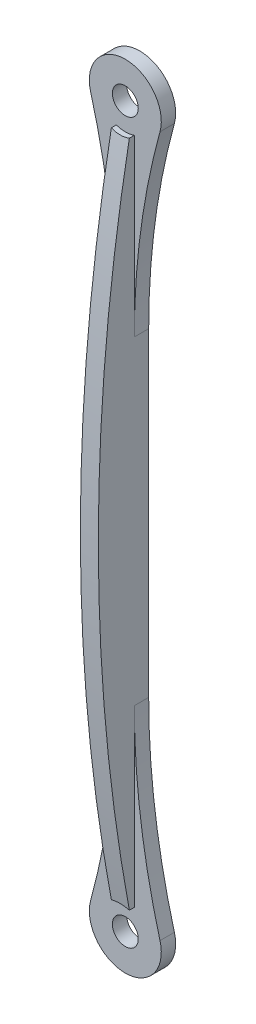
ISO-10303-21;
HEADER;
FILE_DESCRIPTION(('STEP AP214'),'2;1');
FILE_NAME('part.step','',(''),(''),'','','');
FILE_SCHEMA(('AUTOMOTIVE_DESIGN { 1 0 10303 214 1 1 1 1 }'));
ENDSEC;
DATA;
#1=APPLICATION_CONTEXT('core data for automotive mechanical design processes');
#2=APPLICATION_PROTOCOL_DEFINITION('international standard','automotive_design',2000,#1);
#3=PRODUCT_CONTEXT('',#1,'mechanical');
#4=PRODUCT('Part','Part','',(#3));
#5=PRODUCT_RELATED_PRODUCT_CATEGORY('part','',(#4));
#6=PRODUCT_DEFINITION_FORMATION('','',#4);
#7=PRODUCT_DEFINITION_CONTEXT('part definition',#1,'design');
#8=PRODUCT_DEFINITION('design','',#6,#7);
#9=PRODUCT_DEFINITION_SHAPE('','',#8);
#10=(LENGTH_UNIT() NAMED_UNIT(*) SI_UNIT(.MILLI.,.METRE.));
#11=(NAMED_UNIT(*) PLANE_ANGLE_UNIT() SI_UNIT($,.RADIAN.));
#12=(NAMED_UNIT(*) SI_UNIT($,.STERADIAN.) SOLID_ANGLE_UNIT());
#13=UNCERTAINTY_MEASURE_WITH_UNIT(LENGTH_MEASURE(1.E-05),#10,'distance_accuracy_value','');
#14=(GEOMETRIC_REPRESENTATION_CONTEXT(3) GLOBAL_UNCERTAINTY_ASSIGNED_CONTEXT((#13)) GLOBAL_UNIT_ASSIGNED_CONTEXT((#10,
#11,#12)) REPRESENTATION_CONTEXT('',''));
#15=CARTESIAN_POINT('',(0.,0.,0.));
#16=DIRECTION('',(0.,0.,1.));
#17=DIRECTION('',(1.,0.,0.));
#18=AXIS2_PLACEMENT_3D('',#15,#16,#17);
#19=CARTESIAN_POINT('',(1.58749999999998,91.6803547052069,2.54));
#20=DIRECTION('',(-1.,0.,0.));
#21=DIRECTION('',(0.,-1.,0.));
#22=AXIS2_PLACEMENT_3D('',#19,#20,#21);
#23=PLANE('',#22);
#24=DIRECTION('',(0.,0.,-1.));
#25=VECTOR('',#24,1.);
#26=CARTESIAN_POINT('',(1.58750000000004,4.49012806053456,8.89000000000001));
#27=LINE('',#26,#25);
#28=CARTESIAN_POINT('',(1.58750000000004,4.49012806053456,2.54));
#29=VERTEX_POINT('',#28);
#30=CARTESIAN_POINT('',(1.5875,4.49012806053458,3.41381129009333));
#31=VERTEX_POINT('',#30);
#32=EDGE_CURVE('E271',#29,#31,#27,.F.);
#33=ORIENTED_EDGE('',*,*,#32,.F.);
#34=DIRECTION('',(0.,1.,0.));
#35=VECTOR('',#34,1.);
#36=CARTESIAN_POINT('',(1.5875,0.,2.54));
#37=LINE('',#36,#35);
#38=CARTESIAN_POINT('',(1.5875,35.319645294793,2.54000000000001));
#39=VERTEX_POINT('',#38);
#40=EDGE_CURVE('E269',#29,#39,#37,.T.);
#41=ORIENTED_EDGE('',*,*,#40,.T.);
#42=DIRECTION('',(0.,0.,-1.));
#43=VECTOR('',#42,1.);
#44=CARTESIAN_POINT('',(1.58750000000002,35.319645294793,2.54));
#45=LINE('',#44,#43);
#46=CARTESIAN_POINT('',(1.58750000000002,35.319645294793,0.));
#47=VERTEX_POINT('',#46);
#48=EDGE_CURVE('E240',#39,#47,#45,.T.);
#49=ORIENTED_EDGE('',*,*,#48,.T.);
#50=DIRECTION('',(0.,1.,0.));
#51=VECTOR('',#50,1.);
#52=CARTESIAN_POINT('',(1.58749999999998,91.6803547052069,0.));
#53=LINE('',#52,#51);
#54=CARTESIAN_POINT('',(1.58749999999998,91.6803547052069,0.));
#55=VERTEX_POINT('',#54);
#56=EDGE_CURVE('E243',#47,#55,#53,.T.);
#57=ORIENTED_EDGE('',*,*,#56,.T.);
#58=DIRECTION('',(0.,0.,-1.));
#59=VECTOR('',#58,1.);
#60=CARTESIAN_POINT('',(1.58749999999998,91.6803547052069,2.54));
#61=LINE('',#60,#59);
#62=CARTESIAN_POINT('',(1.5875,91.6803547052069,2.54000000000002));
#63=VERTEX_POINT('',#62);
#64=EDGE_CURVE('E264',#63,#55,#61,.T.);
#65=ORIENTED_EDGE('',*,*,#64,.F.);
#66=DIRECTION('',(0.,1.,0.));
#67=VECTOR('',#66,1.);
#68=CARTESIAN_POINT('',(1.58749999999999,35.319645294793,2.54));
#69=LINE('',#68,#67);
#70=CARTESIAN_POINT('',(1.5875,122.509871939465,2.54));
#71=VERTEX_POINT('',#70);
#72=EDGE_CURVE('E167',#63,#71,#69,.T.);
#73=ORIENTED_EDGE('',*,*,#72,.T.);
#74=DIRECTION('',(0.,0.,-1.));
#75=VECTOR('',#74,1.);
#76=CARTESIAN_POINT('',(1.58749999999996,122.509871939465,8.89000000000001));
#77=LINE('',#76,#75);
#78=CARTESIAN_POINT('',(1.5875,122.509871939465,3.41381129009333));
#79=VERTEX_POINT('',#78);
#80=EDGE_CURVE('E151',#79,#71,#77,.T.);
#81=ORIENTED_EDGE('',*,*,#80,.F.);
#82=CARTESIAN_POINT('',(1.5875,63.5000000000001,-311.785000000001));
#83=DIRECTION('',(1.,0.,0.));
#84=DIRECTION('',(0.,0.,-1.));
#85=AXIS2_PLACEMENT_3D('',#82,#83,#84);
#86=CIRCLE('',#85,320.675000000001);
#87=EDGE_CURVE('E274',#79,#31,#86,.T.);
#88=ORIENTED_EDGE('',*,*,#87,.T.);
#89=EDGE_LOOP('',(#33,#41,#49,#57,#65,#73,#81,#88));
#90=FACE_BOUND('',#89,.T.);
#91=ADVANCED_FACE('F39',(#90),#23,.F.);
#92=CARTESIAN_POINT('',(-1.58749999999998,91.6803547052069,2.54));
#93=DIRECTION('',(1.,0.,0.));
#94=DIRECTION('',(0.,1.,0.));
#95=AXIS2_PLACEMENT_3D('',#92,#93,#94);
#96=PLANE('',#95);
#97=DIRECTION('',(0.,0.,-1.));
#98=VECTOR('',#97,1.);
#99=CARTESIAN_POINT('',(-1.58750000000004,4.49012806053456,8.89000000000001));
#100=LINE('',#99,#98);
#101=CARTESIAN_POINT('',(-1.5875,4.49012806053458,3.41381129009333));
#102=VERTEX_POINT('',#101);
#103=CARTESIAN_POINT('',(-1.58750000000004,4.49012806053456,2.54));
#104=VERTEX_POINT('',#103);
#105=EDGE_CURVE('E314',#102,#104,#100,.T.);
#106=ORIENTED_EDGE('',*,*,#105,.F.);
#107=CARTESIAN_POINT('',(-1.5875,63.5000000000001,-311.785000000001));
#108=DIRECTION('',(1.,0.,0.));
#109=DIRECTION('',(0.,0.,-1.));
#110=AXIS2_PLACEMENT_3D('',#107,#108,#109);
#111=CIRCLE('',#110,320.675000000001);
#112=CARTESIAN_POINT('',(-1.5875,122.509871939465,3.41381129009333));
#113=VERTEX_POINT('',#112);
#114=EDGE_CURVE('E162',#113,#102,#111,.T.);
#115=ORIENTED_EDGE('',*,*,#114,.F.);
#116=DIRECTION('',(0.,0.,-1.));
#117=VECTOR('',#116,1.);
#118=CARTESIAN_POINT('',(-1.58749999999996,122.509871939465,8.89000000000001));
#119=LINE('',#118,#117);
#120=CARTESIAN_POINT('',(-1.58749999999999,122.509871939465,2.54));
#121=VERTEX_POINT('',#120);
#122=EDGE_CURVE('E148',#121,#113,#119,.F.);
#123=ORIENTED_EDGE('',*,*,#122,.F.);
#124=DIRECTION('',(0.,1.,0.));
#125=VECTOR('',#124,1.);
#126=CARTESIAN_POINT('',(-1.58749999999999,35.319645294793,2.54));
#127=LINE('',#126,#125);
#128=CARTESIAN_POINT('',(-1.5875,91.6803547052069,2.54000000000002));
#129=VERTEX_POINT('',#128);
#130=EDGE_CURVE('E160',#129,#121,#127,.T.);
#131=ORIENTED_EDGE('',*,*,#130,.F.);
#132=DIRECTION('',(0.,0.,-1.));
#133=VECTOR('',#132,1.);
#134=CARTESIAN_POINT('',(-1.58749999999999,91.6803547052069,2.54));
#135=LINE('',#134,#133);
#136=CARTESIAN_POINT('',(-1.58749999999999,91.6803547052069,0.));
#137=VERTEX_POINT('',#136);
#138=EDGE_CURVE('E257',#129,#137,#135,.T.);
#139=ORIENTED_EDGE('',*,*,#138,.T.);
#140=DIRECTION('',(0.,-1.,0.));
#141=VECTOR('',#140,1.);
#142=CARTESIAN_POINT('',(-1.58749999999998,91.6803547052069,0.));
#143=LINE('',#142,#141);
#144=CARTESIAN_POINT('',(-1.58750000000002,35.319645294793,0.));
#145=VERTEX_POINT('',#144);
#146=EDGE_CURVE('E99',#137,#145,#143,.T.);
#147=ORIENTED_EDGE('',*,*,#146,.T.);
#148=DIRECTION('',(0.,0.,-1.));
#149=VECTOR('',#148,1.);
#150=CARTESIAN_POINT('',(-1.58750000000002,35.319645294793,2.54));
#151=LINE('',#150,#149);
#152=CARTESIAN_POINT('',(-1.5875,35.319645294793,2.54000000000001));
#153=VERTEX_POINT('',#152);
#154=EDGE_CURVE('E255',#153,#145,#151,.T.);
#155=ORIENTED_EDGE('',*,*,#154,.F.);
#156=DIRECTION('',(0.,1.,0.));
#157=VECTOR('',#156,1.);
#158=CARTESIAN_POINT('',(-1.5875,0.,2.54));
#159=LINE('',#158,#157);
#160=EDGE_CURVE('E317',#104,#153,#159,.T.);
#161=ORIENTED_EDGE('',*,*,#160,.F.);
#162=EDGE_LOOP('',(#106,#115,#123,#131,#139,#147,#155,#161));
#163=FACE_BOUND('',#162,.T.);
#164=ADVANCED_FACE('F159',(#163),#96,.F.);
#165=CARTESIAN_POINT('',(1.5875,63.5000000000001,-311.785000000001));
#166=DIRECTION('',(-1.,0.,0.));
#167=DIRECTION('',(0.,0.,1.));
#168=AXIS2_PLACEMENT_3D('',#165,#166,#167);
#169=CYLINDRICAL_SURFACE('',#168,320.675000000001);
#170=CARTESIAN_POINT('',(1.5875,4.49012806053458,3.41381129009333));
#171=CARTESIAN_POINT('',(1.46169117248413,4.53462550573244,3.42214130453744));
#172=CARTESIAN_POINT('',(1.33394188431356,4.57382607389402,3.42947101278657));
#173=CARTESIAN_POINT('',(1.07552115317538,4.64138487747829,3.44209326481297));
#174=CARTESIAN_POINT('',(0.944849962539278,4.6697440453511,3.44738598378844));
#175=CARTESIAN_POINT('',(0.685244745499197,4.71473409003212,3.45577880465509));
#176=CARTESIAN_POINT('',(0.556366057563678,4.73167389094725,3.45893666749377));
#177=CARTESIAN_POINT('',(0.297625183572726,4.75496534326701,3.46327782966646));
#178=CARTESIAN_POINT('',(0.167763012789349,4.76131715875034,3.46446115959919));
#179=CARTESIAN_POINT('',(-0.0981705761281273,4.76343056081247,3.46485493987919));
#180=CARTESIAN_POINT('',(-0.234246505925861,4.75867952363175,3.46396989221842));
#181=CARTESIAN_POINT('',(-0.505472248734118,4.73755347504202,3.46003264904546));
#182=CARTESIAN_POINT('',(-0.640621968562923,4.7211773109247,3.4569802386249));
#183=CARTESIAN_POINT('',(-0.913051412713923,4.67625533447134,3.44860109177461));
#184=CARTESIAN_POINT('',(-1.05027056936643,4.64735392958457,3.44320789291906));
#185=CARTESIAN_POINT('',(-1.32153822850639,4.57762021830593,3.43018035505578));
#186=CARTESIAN_POINT('',(-1.4555866410449,4.53678757388163,3.42254595255089));
#187=CARTESIAN_POINT('',(-1.5875,4.49012806053458,3.41381129009336));
#188=B_SPLINE_CURVE_WITH_KNOTS('',3,(#170,#171,#172,#173,#174,#175,#176,#177,#178,#179,#180,
#181,#182,#183,#184,#185,#186,#187),.UNSPECIFIED.,.F.,.F.,(4,2,2,2,2,2,2,2,4),(0.,
0.400998727898546,0.801962958824749,1.19159075221517,1.58121250760947,1.98917615140464,
2.39718025314743,2.81761577760374,3.23806321487292),.UNSPECIFIED.);
#189=EDGE_CURVE('E11',#31,#102,#188,.T.);
#190=ORIENTED_EDGE('',*,*,#189,.F.);
#191=ORIENTED_EDGE('',*,*,#87,.F.);
#192=CARTESIAN_POINT('',(-1.5875,122.509871939465,3.41381129009333));
#193=CARTESIAN_POINT('',(-1.46169117248413,122.465374494268,3.42214130453747));
#194=CARTESIAN_POINT('',(-1.33394188431356,122.426173926106,3.42947101278662));
#195=CARTESIAN_POINT('',(-1.07552115317538,122.358615122522,3.44209326481305));
#196=CARTESIAN_POINT('',(-0.944849962539281,122.330255954649,3.44738598378853));
#197=CARTESIAN_POINT('',(-0.6852447454992,122.285265909968,3.45577880465519));
#198=CARTESIAN_POINT('',(-0.55636605756368,122.268326109053,3.45893666749386));
#199=CARTESIAN_POINT('',(-0.297625183572728,122.245034656733,3.46327782966654));
#200=CARTESIAN_POINT('',(-0.167763012789351,122.23868284125,3.46446115959926));
#201=CARTESIAN_POINT('',(0.098170576128125,122.236569439187,3.46485493987924));
#202=CARTESIAN_POINT('',(0.234246505925859,122.241320476368,3.46396989221844));
#203=CARTESIAN_POINT('',(0.505472248734115,122.262446524958,3.46003264904544));
#204=CARTESIAN_POINT('',(0.640621968562919,122.278822689075,3.45698023862486));
#205=CARTESIAN_POINT('',(0.913051412713919,122.323744665529,3.44860109177455));
#206=CARTESIAN_POINT('',(1.05027056936643,122.352646070415,3.443207892919));
#207=CARTESIAN_POINT('',(1.32153822850638,122.422379781694,3.43018035505576));
#208=CARTESIAN_POINT('',(1.4555866410449,122.463212426118,3.4225459525509));
#209=CARTESIAN_POINT('',(1.5875,122.509871939465,3.41381129009342));
#210=B_SPLINE_CURVE_WITH_KNOTS('',3,(#192,#193,#194,#195,#196,#197,#198,#199,#200,#201,#202,
#203,#204,#205,#206,#207,#208,#209),.UNSPECIFIED.,.F.,.F.,(4,2,2,2,2,2,2,2,4),(0.,
0.400998727898547,0.801962958824751,1.19159075221517,1.58121250760947,1.98917615140465,
2.39718025314743,2.81761577760374,3.23806321487292),.UNSPECIFIED.);
#211=EDGE_CURVE('E54',#113,#79,#210,.T.);
#212=ORIENTED_EDGE('',*,*,#211,.F.);
#213=ORIENTED_EDGE('',*,*,#114,.T.);
#214=EDGE_LOOP('',(#190,#191,#212,#213));
#215=FACE_BOUND('',#214,.T.);
#216=ADVANCED_FACE('F179',(#215),#169,.T.);
#217=CARTESIAN_POINT('',(-128.5875,35.319645294793,2.54));
#218=DIRECTION('',(0.,0.,1.));
#219=DIRECTION('',(1.,0.,0.));
#220=AXIS2_PLACEMENT_3D('',#217,#218,#219);
#221=PLANE('',#220);
#222=CARTESIAN_POINT('',(0.,0.,2.54));
#223=DIRECTION('',(0.,0.,1.));
#224=DIRECTION('',(1.,0.,0.));
#225=AXIS2_PLACEMENT_3D('',#222,#223,#224);
#226=CIRCLE('',#225,2.286);
#227=CARTESIAN_POINT('',(2.286,0.,2.54));
#228=VERTEX_POINT('',#227);
#229=EDGE_CURVE('E308',#228,#228,#226,.T.);
#230=ORIENTED_EDGE('',*,*,#229,.F.);
#231=EDGE_LOOP('',(#230));
#232=FACE_BOUND('',#231,.T.);
#233=ORIENTED_EDGE('',*,*,#40,.F.);
#234=CARTESIAN_POINT('',(0.,0.,2.54));
#235=DIRECTION('',(0.,0.,1.));
#236=DIRECTION('',(1.,0.,0.));
#237=AXIS2_PLACEMENT_3D('',#234,#235,#236);
#238=CIRCLE('',#237,4.7625);
#239=EDGE_CURVE('E154',#29,#104,#238,.T.);
#240=ORIENTED_EDGE('',*,*,#239,.T.);
#241=ORIENTED_EDGE('',*,*,#160,.T.);
#242=CARTESIAN_POINT('',(-128.5875,35.319645294793,2.54));
#243=DIRECTION('',(0.,0.,-1.));
#244=DIRECTION('',(1.,0.,0.));
#245=AXIS2_PLACEMENT_3D('',#242,#243,#244);
#246=CIRCLE('',#245,127.);
#247=CARTESIAN_POINT('',(-6.12321428571427,1.68188787118062,2.54));
#248=VERTEX_POINT('',#247);
#249=EDGE_CURVE('E254',#153,#248,#246,.T.);
#250=ORIENTED_EDGE('',*,*,#249,.T.);
#251=CARTESIAN_POINT('',(0.,0.,2.54));
#252=DIRECTION('',(0.,0.,1.));
#253=DIRECTION('',(1.,0.,0.));
#254=AXIS2_PLACEMENT_3D('',#251,#252,#253);
#255=CIRCLE('',#254,6.34999999999998);
#256=CARTESIAN_POINT('',(6.12321428571427,1.68188787118062,2.54));
#257=VERTEX_POINT('',#256);
#258=EDGE_CURVE('E107',#248,#257,#255,.T.);
#259=ORIENTED_EDGE('',*,*,#258,.T.);
#260=CARTESIAN_POINT('',(128.5875,35.319645294793,2.54));
#261=DIRECTION('',(0.,0.,-1.));
#262=DIRECTION('',(-1.,0.,0.));
#263=AXIS2_PLACEMENT_3D('',#260,#261,#262);
#264=CIRCLE('',#263,127.);
#265=EDGE_CURVE('E239',#257,#39,#264,.T.);
#266=ORIENTED_EDGE('',*,*,#265,.T.);
#267=EDGE_LOOP('',(#233,#240,#241,#250,#259,#266));
#268=FACE_BOUND('',#267,.T.);
#269=ADVANCED_FACE('F223',(#232,#268),#221,.T.);
#270=CARTESIAN_POINT('',(-128.5875,35.319645294793,2.54));
#271=DIRECTION('',(0.,0.,-1.));
#272=DIRECTION('',(-1.,0.,0.));
#273=AXIS2_PLACEMENT_3D('',#270,#271,#272);
#274=CYLINDRICAL_SURFACE('',#273,127.);
#275=CARTESIAN_POINT('',(-128.5875,35.319645294793,0.));
#276=DIRECTION('',(0.,0.,-1.));
#277=DIRECTION('',(1.,0.,0.));
#278=AXIS2_PLACEMENT_3D('',#275,#276,#277);
#279=CIRCLE('',#278,127.);
#280=CARTESIAN_POINT('',(-6.12321428571427,1.68188787118062,0.));
#281=VERTEX_POINT('',#280);
#282=EDGE_CURVE('E234',#145,#281,#279,.T.);
#283=ORIENTED_EDGE('',*,*,#282,.T.);
#284=DIRECTION('',(0.,0.,-1.));
#285=VECTOR('',#284,1.);
#286=CARTESIAN_POINT('',(-6.12321428571427,1.68188787118062,2.54));
#287=LINE('',#286,#285);
#288=EDGE_CURVE('E168',#248,#281,#287,.T.);
#289=ORIENTED_EDGE('',*,*,#288,.F.);
#290=ORIENTED_EDGE('',*,*,#249,.F.);
#291=ORIENTED_EDGE('',*,*,#154,.T.);
#292=EDGE_LOOP('',(#283,#289,#290,#291));
#293=FACE_BOUND('',#292,.T.);
#294=ADVANCED_FACE('F41',(#293),#274,.F.);
#295=CARTESIAN_POINT('',(0.,0.,2.54));
#296=DIRECTION('',(0.,0.,-1.));
#297=DIRECTION('',(-1.,0.,0.));
#298=AXIS2_PLACEMENT_3D('',#295,#296,#297);
#299=CYLINDRICAL_SURFACE('',#298,6.34999999999998);
#300=CARTESIAN_POINT('',(0.,0.,0.));
#301=DIRECTION('',(0.,0.,1.));
#302=DIRECTION('',(1.,0.,0.));
#303=AXIS2_PLACEMENT_3D('',#300,#301,#302);
#304=CIRCLE('',#303,6.34999999999998);
#305=CARTESIAN_POINT('',(6.12321428571427,1.68188787118062,0.));
#306=VERTEX_POINT('',#305);
#307=EDGE_CURVE('E225',#281,#306,#304,.T.);
#308=ORIENTED_EDGE('',*,*,#307,.T.);
#309=DIRECTION('',(0.,0.,-1.));
#310=VECTOR('',#309,1.);
#311=CARTESIAN_POINT('',(6.12321428571427,1.68188787118062,2.54));
#312=LINE('',#311,#310);
#313=EDGE_CURVE('E171',#257,#306,#312,.T.);
#314=ORIENTED_EDGE('',*,*,#313,.F.);
#315=ORIENTED_EDGE('',*,*,#258,.F.);
#316=ORIENTED_EDGE('',*,*,#288,.T.);
#317=EDGE_LOOP('',(#308,#314,#315,#316));
#318=FACE_BOUND('',#317,.T.);
#319=ADVANCED_FACE('F216',(#318),#299,.T.);
#320=CARTESIAN_POINT('',(128.5875,35.319645294793,2.54));
#321=DIRECTION('',(0.,0.,-1.));
#322=DIRECTION('',(-1.,0.,0.));
#323=AXIS2_PLACEMENT_3D('',#320,#321,#322);
#324=CYLINDRICAL_SURFACE('',#323,127.);
#325=CARTESIAN_POINT('',(128.5875,35.319645294793,0.));
#326=DIRECTION('',(0.,0.,-1.));
#327=DIRECTION('',(-1.,0.,0.));
#328=AXIS2_PLACEMENT_3D('',#325,#326,#327);
#329=CIRCLE('',#328,127.);
#330=EDGE_CURVE('E233',#306,#47,#329,.T.);
#331=ORIENTED_EDGE('',*,*,#330,.T.);
#332=ORIENTED_EDGE('',*,*,#48,.F.);
#333=ORIENTED_EDGE('',*,*,#265,.F.);
#334=ORIENTED_EDGE('',*,*,#313,.T.);
#335=EDGE_LOOP('',(#331,#332,#333,#334));
#336=FACE_BOUND('',#335,.T.);
#337=ADVANCED_FACE('F214',(#336),#324,.F.);
#338=CARTESIAN_POINT('',(128.5875,91.6803547052069,2.54));
#339=DIRECTION('',(0.,0.,-1.));
#340=DIRECTION('',(-1.,0.,0.));
#341=AXIS2_PLACEMENT_3D('',#338,#339,#340);
#342=CYLINDRICAL_SURFACE('',#341,127.);
#343=CARTESIAN_POINT('',(128.5875,91.6803547052069,0.));
#344=DIRECTION('',(0.,0.,-1.));
#345=DIRECTION('',(1.,0.,0.));
#346=AXIS2_PLACEMENT_3D('',#343,#344,#345);
#347=CIRCLE('',#346,127.);
#348=CARTESIAN_POINT('',(6.12321428571429,125.318112128819,0.));
#349=VERTEX_POINT('',#348);
#350=EDGE_CURVE('E245',#55,#349,#347,.T.);
#351=ORIENTED_EDGE('',*,*,#350,.T.);
#352=DIRECTION('',(0.,0.,-1.));
#353=VECTOR('',#352,1.);
#354=CARTESIAN_POINT('',(6.12321428571429,125.318112128819,2.54));
#355=LINE('',#354,#353);
#356=CARTESIAN_POINT('',(6.12321428571429,125.318112128819,2.54));
#357=VERTEX_POINT('',#356);
#358=EDGE_CURVE('E261',#357,#349,#355,.T.);
#359=ORIENTED_EDGE('',*,*,#358,.F.);
#360=CARTESIAN_POINT('',(128.5875,91.6803547052069,2.54));
#361=DIRECTION('',(0.,0.,-1.));
#362=DIRECTION('',(1.,0.,0.));
#363=AXIS2_PLACEMENT_3D('',#360,#361,#362);
#364=CIRCLE('',#363,127.);
#365=EDGE_CURVE('E276',#63,#357,#364,.T.);
#366=ORIENTED_EDGE('',*,*,#365,.F.);
#367=ORIENTED_EDGE('',*,*,#64,.T.);
#368=EDGE_LOOP('',(#351,#359,#366,#367));
#369=FACE_BOUND('',#368,.T.);
#370=ADVANCED_FACE('F212',(#369),#342,.F.);
#371=CARTESIAN_POINT('',(0.,127.,2.54));
#372=DIRECTION('',(0.,0.,-1.));
#373=DIRECTION('',(-1.,0.,0.));
#374=AXIS2_PLACEMENT_3D('',#371,#372,#373);
#375=CYLINDRICAL_SURFACE('',#374,6.34999999999998);
#376=CARTESIAN_POINT('',(0.,127.,0.));
#377=DIRECTION('',(0.,0.,1.));
#378=DIRECTION('',(1.,0.,0.));
#379=AXIS2_PLACEMENT_3D('',#376,#377,#378);
#380=CIRCLE('',#379,6.34999999999998);
#381=CARTESIAN_POINT('',(-6.12321428571427,125.318112128819,0.));
#382=VERTEX_POINT('',#381);
#383=EDGE_CURVE('E250',#349,#382,#380,.T.);
#384=ORIENTED_EDGE('',*,*,#383,.T.);
#385=DIRECTION('',(0.,0.,-1.));
#386=VECTOR('',#385,1.);
#387=CARTESIAN_POINT('',(-6.12321428571427,125.318112128819,2.54));
#388=LINE('',#387,#386);
#389=CARTESIAN_POINT('',(-6.12321428571427,125.318112128819,2.54));
#390=VERTEX_POINT('',#389);
#391=EDGE_CURVE('E259',#390,#382,#388,.T.);
#392=ORIENTED_EDGE('',*,*,#391,.F.);
#393=CARTESIAN_POINT('',(0.,127.,2.54));
#394=DIRECTION('',(0.,0.,1.));
#395=DIRECTION('',(1.,0.,0.));
#396=AXIS2_PLACEMENT_3D('',#393,#394,#395);
#397=CIRCLE('',#396,6.34999999999998);
#398=EDGE_CURVE('E62',#357,#390,#397,.T.);
#399=ORIENTED_EDGE('',*,*,#398,.F.);
#400=ORIENTED_EDGE('',*,*,#358,.T.);
#401=EDGE_LOOP('',(#384,#392,#399,#400));
#402=FACE_BOUND('',#401,.T.);
#403=ADVANCED_FACE('F286',(#402),#375,.T.);
#404=CARTESIAN_POINT('',(-128.5875,91.6803547052069,2.54));
#405=DIRECTION('',(0.,0.,-1.));
#406=DIRECTION('',(-1.,0.,0.));
#407=AXIS2_PLACEMENT_3D('',#404,#405,#406);
#408=CYLINDRICAL_SURFACE('',#407,127.);
#409=CARTESIAN_POINT('',(-128.5875,91.6803547052069,0.));
#410=DIRECTION('',(0.,0.,-1.));
#411=DIRECTION('',(-1.,0.,0.));
#412=AXIS2_PLACEMENT_3D('',#409,#410,#411);
#413=CIRCLE('',#412,127.);
#414=EDGE_CURVE('E92',#382,#137,#413,.T.);
#415=ORIENTED_EDGE('',*,*,#414,.T.);
#416=ORIENTED_EDGE('',*,*,#138,.F.);
#417=CARTESIAN_POINT('',(-128.5875,91.6803547052069,2.54));
#418=DIRECTION('',(0.,0.,-1.));
#419=DIRECTION('',(-1.,0.,0.));
#420=AXIS2_PLACEMENT_3D('',#417,#418,#419);
#421=CIRCLE('',#420,127.);
#422=EDGE_CURVE('E166',#390,#129,#421,.T.);
#423=ORIENTED_EDGE('',*,*,#422,.F.);
#424=ORIENTED_EDGE('',*,*,#391,.T.);
#425=EDGE_LOOP('',(#415,#416,#423,#424));
#426=FACE_BOUND('',#425,.T.);
#427=ADVANCED_FACE('F288',(#426),#408,.F.);
#428=CARTESIAN_POINT('',(0.,127.,2.54));
#429=DIRECTION('',(0.,0.,1.));
#430=DIRECTION('',(1.,0.,0.));
#431=AXIS2_PLACEMENT_3D('',#428,#429,#430);
#432=CIRCLE('',#431,2.286);
#433=CARTESIAN_POINT('',(2.286,127.,2.54));
#434=VERTEX_POINT('',#433);
#435=EDGE_CURVE('E305',#434,#434,#432,.T.);
#436=ORIENTED_EDGE('',*,*,#435,.F.);
#437=EDGE_LOOP('',(#436));
#438=FACE_BOUND('',#437,.T.);
#439=ORIENTED_EDGE('',*,*,#130,.T.);
#440=CARTESIAN_POINT('',(0.,127.,2.54));
#441=DIRECTION('',(0.,0.,1.));
#442=DIRECTION('',(1.,0.,0.));
#443=AXIS2_PLACEMENT_3D('',#440,#441,#442);
#444=CIRCLE('',#443,4.7625);
#445=EDGE_CURVE('E145',#121,#71,#444,.T.);
#446=ORIENTED_EDGE('',*,*,#445,.T.);
#447=ORIENTED_EDGE('',*,*,#72,.F.);
#448=ORIENTED_EDGE('',*,*,#365,.T.);
#449=ORIENTED_EDGE('',*,*,#398,.T.);
#450=ORIENTED_EDGE('',*,*,#422,.T.);
#451=EDGE_LOOP('',(#439,#446,#447,#448,#449,#450));
#452=FACE_BOUND('',#451,.T.);
#453=ADVANCED_FACE('F164',(#438,#452),#221,.T.);
#454=CARTESIAN_POINT('',(-128.5875,35.319645294793,0.));
#455=DIRECTION('',(0.,0.,1.));
#456=DIRECTION('',(1.,0.,0.));
#457=AXIS2_PLACEMENT_3D('',#454,#455,#456);
#458=PLANE('',#457);
#459=CARTESIAN_POINT('',(0.,0.,0.));
#460=DIRECTION('',(0.,0.,1.));
#461=DIRECTION('',(1.,0.,0.));
#462=AXIS2_PLACEMENT_3D('',#459,#460,#461);
#463=CIRCLE('',#462,2.286);
#464=CARTESIAN_POINT('',(2.286,0.,0.));
#465=VERTEX_POINT('',#464);
#466=EDGE_CURVE('E155',#465,#465,#463,.T.);
#467=ORIENTED_EDGE('',*,*,#466,.T.);
#468=EDGE_LOOP('',(#467));
#469=FACE_BOUND('',#468,.T.);
#470=CARTESIAN_POINT('',(0.,127.,0.));
#471=DIRECTION('',(0.,0.,1.));
#472=DIRECTION('',(1.,0.,0.));
#473=AXIS2_PLACEMENT_3D('',#470,#471,#472);
#474=CIRCLE('',#473,2.286);
#475=CARTESIAN_POINT('',(2.286,127.,0.));
#476=VERTEX_POINT('',#475);
#477=EDGE_CURVE('E304',#476,#476,#474,.T.);
#478=ORIENTED_EDGE('',*,*,#477,.T.);
#479=EDGE_LOOP('',(#478));
#480=FACE_BOUND('',#479,.T.);
#481=ORIENTED_EDGE('',*,*,#282,.F.);
#482=ORIENTED_EDGE('',*,*,#146,.F.);
#483=ORIENTED_EDGE('',*,*,#414,.F.);
#484=ORIENTED_EDGE('',*,*,#383,.F.);
#485=ORIENTED_EDGE('',*,*,#350,.F.);
#486=ORIENTED_EDGE('',*,*,#56,.F.);
#487=ORIENTED_EDGE('',*,*,#330,.F.);
#488=ORIENTED_EDGE('',*,*,#307,.F.);
#489=EDGE_LOOP('',(#481,#482,#483,#484,#485,#486,#487,#488));
#490=FACE_BOUND('',#489,.T.);
#491=ADVANCED_FACE('F185',(#469,#480,#490),#458,.F.);
#492=CARTESIAN_POINT('',(0.,127.,8.89000000000001));
#493=DIRECTION('',(0.,0.,-1.));
#494=DIRECTION('',(-1.,0.,0.));
#495=AXIS2_PLACEMENT_3D('',#492,#493,#494);
#496=CYLINDRICAL_SURFACE('',#495,4.7625);
#497=ORIENTED_EDGE('',*,*,#80,.T.);
#498=ORIENTED_EDGE('',*,*,#445,.F.);
#499=ORIENTED_EDGE('',*,*,#122,.T.);
#500=ORIENTED_EDGE('',*,*,#211,.T.);
#501=EDGE_LOOP('',(#497,#498,#499,#500));
#502=FACE_BOUND('',#501,.T.);
#503=ADVANCED_FACE('F147',(#502),#496,.F.);
#504=CARTESIAN_POINT('',(0.,0.,8.89000000000001));
#505=DIRECTION('',(0.,0.,-1.));
#506=DIRECTION('',(-1.,0.,0.));
#507=AXIS2_PLACEMENT_3D('',#504,#505,#506);
#508=CYLINDRICAL_SURFACE('',#507,4.7625);
#509=ORIENTED_EDGE('',*,*,#32,.T.);
#510=ORIENTED_EDGE('',*,*,#189,.T.);
#511=ORIENTED_EDGE('',*,*,#105,.T.);
#512=ORIENTED_EDGE('',*,*,#239,.F.);
#513=EDGE_LOOP('',(#509,#510,#511,#512));
#514=FACE_BOUND('',#513,.T.);
#515=ADVANCED_FACE('F184',(#514),#508,.F.);
#516=CARTESIAN_POINT('',(0.,127.,0.));
#517=DIRECTION('',(0.,0.,1.));
#518=DIRECTION('',(1.,0.,0.));
#519=AXIS2_PLACEMENT_3D('',#516,#517,#518);
#520=CYLINDRICAL_SURFACE('',#519,2.286);
#521=ORIENTED_EDGE('',*,*,#477,.F.);
#522=EDGE_LOOP('',(#521));
#523=FACE_BOUND('',#522,.T.);
#524=ORIENTED_EDGE('',*,*,#435,.T.);
#525=EDGE_LOOP('',(#524));
#526=FACE_BOUND('',#525,.T.);
#527=ADVANCED_FACE('F189',(#523,#526),#520,.F.);
#528=CARTESIAN_POINT('',(0.,0.,0.));
#529=DIRECTION('',(0.,0.,1.));
#530=DIRECTION('',(1.,0.,0.));
#531=AXIS2_PLACEMENT_3D('',#528,#529,#530);
#532=CYLINDRICAL_SURFACE('',#531,2.286);
#533=ORIENTED_EDGE('',*,*,#466,.F.);
#534=EDGE_LOOP('',(#533));
#535=FACE_BOUND('',#534,.T.);
#536=ORIENTED_EDGE('',*,*,#229,.T.);
#537=EDGE_LOOP('',(#536));
#538=FACE_BOUND('',#537,.T.);
#539=ADVANCED_FACE('F193',(#535,#538),#532,.F.);
#540=CLOSED_SHELL('',(#91,#164,#216,#269,#294,#319,#337,#370,#403,#427,#453,#491,#503,#515,#527,#539));
#541=MANIFOLD_SOLID_BREP('B2',#540);
#542=ADVANCED_BREP_SHAPE_REPRESENTATION('',(#18,#541),#14);
#543=SHAPE_DEFINITION_REPRESENTATION(#9,#542);
ENDSEC;
END-ISO-10303-21;
